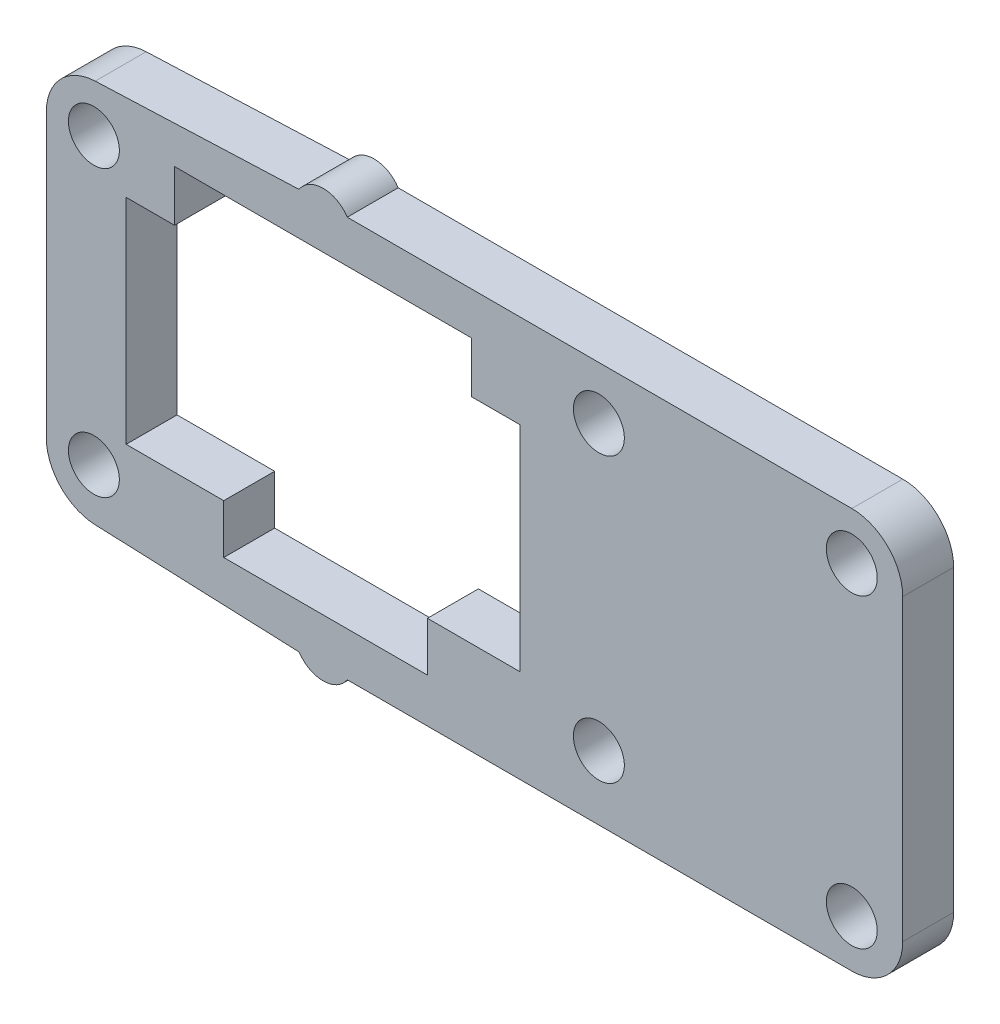
ISO-10303-21;
HEADER;
FILE_DESCRIPTION(('STEP AP214'),'2;1');
FILE_NAME('part.step','',(''),(''),'','','');
FILE_SCHEMA(('AUTOMOTIVE_DESIGN { 1 0 10303 214 1 1 1 1 }'));
ENDSEC;
DATA;
#1=APPLICATION_CONTEXT('core data for automotive mechanical design processes');
#2=APPLICATION_PROTOCOL_DEFINITION('international standard','automotive_design',2000,#1);
#3=PRODUCT_CONTEXT('',#1,'mechanical');
#4=PRODUCT('Part','Part','',(#3));
#5=PRODUCT_RELATED_PRODUCT_CATEGORY('part','',(#4));
#6=PRODUCT_DEFINITION_FORMATION('','',#4);
#7=PRODUCT_DEFINITION_CONTEXT('part definition',#1,'design');
#8=PRODUCT_DEFINITION('design','',#6,#7);
#9=PRODUCT_DEFINITION_SHAPE('','',#8);
#10=(LENGTH_UNIT() NAMED_UNIT(*) SI_UNIT(.MILLI.,.METRE.));
#11=(NAMED_UNIT(*) PLANE_ANGLE_UNIT() SI_UNIT($,.RADIAN.));
#12=(NAMED_UNIT(*) SI_UNIT($,.STERADIAN.) SOLID_ANGLE_UNIT());
#13=UNCERTAINTY_MEASURE_WITH_UNIT(LENGTH_MEASURE(1.E-05),#10,'distance_accuracy_value','');
#14=(GEOMETRIC_REPRESENTATION_CONTEXT(3) GLOBAL_UNCERTAINTY_ASSIGNED_CONTEXT((#13)) GLOBAL_UNIT_ASSIGNED_CONTEXT((#10,
#11,#12)) REPRESENTATION_CONTEXT('',''));
#15=CARTESIAN_POINT('',(0.,0.,0.));
#16=DIRECTION('',(0.,0.,1.));
#17=DIRECTION('',(1.,0.,0.));
#18=AXIS2_PLACEMENT_3D('',#15,#16,#17);
#19=CARTESIAN_POINT('',(734.593549902307,733.876262300404,-3.));
#20=DIRECTION('',(0.,0.,1.));
#21=DIRECTION('',(1.,0.,0.));
#22=AXIS2_PLACEMENT_3D('',#19,#20,#21);
#23=CYLINDRICAL_SURFACE('',#22,2.99999999999839);
#24=CARTESIAN_POINT('',(734.593549902307,733.876262300404,0.));
#25=DIRECTION('',(0.,0.,1.));
#26=DIRECTION('',(-1.,0.,0.));
#27=AXIS2_PLACEMENT_3D('',#24,#25,#26);
#28=CIRCLE('',#27,2.99999999999839);
#29=CARTESIAN_POINT('',(737.593549902304,733.876262300405,0.));
#30=VERTEX_POINT('',#29);
#31=CARTESIAN_POINT('',(734.593549902304,736.876262300405,0.));
#32=VERTEX_POINT('',#31);
#33=EDGE_CURVE('E285',#30,#32,#28,.T.);
#34=ORIENTED_EDGE('',*,*,#33,.F.);
#35=DIRECTION('',(0.,0.,1.));
#36=VECTOR('',#35,1.);
#37=CARTESIAN_POINT('',(737.593549902304,733.876262300405,-3.));
#38=LINE('',#37,#36);
#39=CARTESIAN_POINT('',(737.593549902304,733.876262300405,-3.));
#40=VERTEX_POINT('',#39);
#41=EDGE_CURVE('E11',#40,#30,#38,.T.);
#42=ORIENTED_EDGE('',*,*,#41,.F.);
#43=CARTESIAN_POINT('',(734.593549902307,733.876262300404,-3.));
#44=DIRECTION('',(0.,0.,1.));
#45=DIRECTION('',(-1.,0.,0.));
#46=AXIS2_PLACEMENT_3D('',#43,#44,#45);
#47=CIRCLE('',#46,2.99999999999839);
#48=CARTESIAN_POINT('',(734.593549902304,736.876262300405,-3.));
#49=VERTEX_POINT('',#48);
#50=EDGE_CURVE('E305',#40,#49,#47,.T.);
#51=ORIENTED_EDGE('',*,*,#50,.T.);
#52=DIRECTION('',(0.,0.,1.));
#53=VECTOR('',#52,1.);
#54=CARTESIAN_POINT('',(734.593549902304,736.876262300405,-3.));
#55=LINE('',#54,#53);
#56=EDGE_CURVE('E342',#49,#32,#55,.T.);
#57=ORIENTED_EDGE('',*,*,#56,.T.);
#58=EDGE_LOOP('',(#34,#42,#51,#57));
#59=FACE_BOUND('',#58,.T.);
#60=ADVANCED_FACE('F39',(#59),#23,.T.);
#61=CARTESIAN_POINT('',(737.593549902304,733.876262300405,-3.));
#62=DIRECTION('',(1.,1.76626390281275E-13,0.));
#63=DIRECTION('',(-1.76626390281275E-13,1.,0.));
#64=AXIS2_PLACEMENT_3D('',#61,#62,#63);
#65=PLANE('',#64);
#66=DIRECTION('',(-1.76626390281275E-13,1.,0.));
#67=VECTOR('',#66,1.);
#68=CARTESIAN_POINT('',(737.593549902304,733.876262300405,0.));
#69=LINE('',#68,#67);
#70=CARTESIAN_POINT('',(737.593549902307,716.276262300404,0.));
#71=VERTEX_POINT('',#70);
#72=EDGE_CURVE('E309',#71,#30,#69,.T.);
#73=ORIENTED_EDGE('',*,*,#72,.F.);
#74=DIRECTION('',(0.,0.,1.));
#75=VECTOR('',#74,1.);
#76=CARTESIAN_POINT('',(737.593549902307,716.276262300404,-3.));
#77=LINE('',#76,#75);
#78=CARTESIAN_POINT('',(737.593549902307,716.276262300404,-3.));
#79=VERTEX_POINT('',#78);
#80=EDGE_CURVE('E47',#79,#71,#77,.T.);
#81=ORIENTED_EDGE('',*,*,#80,.F.);
#82=DIRECTION('',(-1.76626390281275E-13,1.,0.));
#83=VECTOR('',#82,1.);
#84=CARTESIAN_POINT('',(737.593549902304,733.876262300405,-3.));
#85=LINE('',#84,#83);
#86=EDGE_CURVE('E339',#79,#40,#85,.T.);
#87=ORIENTED_EDGE('',*,*,#86,.T.);
#88=ORIENTED_EDGE('',*,*,#41,.T.);
#89=EDGE_LOOP('',(#73,#81,#87,#88));
#90=FACE_BOUND('',#89,.T.);
#91=ADVANCED_FACE('F482',(#90),#65,.T.);
#92=CARTESIAN_POINT('',(734.593549902307,716.276262300404,-3.));
#93=DIRECTION('',(0.,0.,1.));
#94=DIRECTION('',(1.,0.,0.));
#95=AXIS2_PLACEMENT_3D('',#92,#93,#94);
#96=CYLINDRICAL_SURFACE('',#95,3.);
#97=CARTESIAN_POINT('',(734.593549902307,716.276262300404,0.));
#98=DIRECTION('',(0.,0.,1.));
#99=DIRECTION('',(-1.,0.,0.));
#100=AXIS2_PLACEMENT_3D('',#97,#98,#99);
#101=CIRCLE('',#100,3.);
#102=CARTESIAN_POINT('',(734.593549902307,713.276262300404,0.));
#103=VERTEX_POINT('',#102);
#104=EDGE_CURVE('E372',#103,#71,#101,.T.);
#105=ORIENTED_EDGE('',*,*,#104,.F.);
#106=DIRECTION('',(0.,0.,1.));
#107=VECTOR('',#106,1.);
#108=CARTESIAN_POINT('',(734.593549902307,713.276262300404,-3.));
#109=LINE('',#108,#107);
#110=CARTESIAN_POINT('',(734.593549902307,713.276262300404,-3.));
#111=VERTEX_POINT('',#110);
#112=EDGE_CURVE('E378',#111,#103,#109,.T.);
#113=ORIENTED_EDGE('',*,*,#112,.F.);
#114=CARTESIAN_POINT('',(734.593549902307,716.276262300404,-3.));
#115=DIRECTION('',(0.,0.,1.));
#116=DIRECTION('',(-1.,0.,0.));
#117=AXIS2_PLACEMENT_3D('',#114,#115,#116);
#118=CIRCLE('',#117,3.);
#119=EDGE_CURVE('E336',#111,#79,#118,.T.);
#120=ORIENTED_EDGE('',*,*,#119,.T.);
#121=ORIENTED_EDGE('',*,*,#80,.T.);
#122=EDGE_LOOP('',(#105,#113,#120,#121));
#123=FACE_BOUND('',#122,.T.);
#124=ADVANCED_FACE('F479',(#123),#96,.T.);
#125=CARTESIAN_POINT('',(734.593549902307,713.276262300404,-3.));
#126=DIRECTION('',(0.,-1.,0.));
#127=DIRECTION('',(1.,0.,0.));
#128=AXIS2_PLACEMENT_3D('',#125,#126,#127);
#129=PLANE('',#128);
#130=DIRECTION('',(1.,0.,0.));
#131=VECTOR('',#130,1.);
#132=CARTESIAN_POINT('',(734.593549902307,713.276262300404,0.));
#133=LINE('',#132,#131);
#134=CARTESIAN_POINT('',(704.870597734541,713.276262300403,0.));
#135=VERTEX_POINT('',#134);
#136=EDGE_CURVE('E369',#135,#103,#133,.T.);
#137=ORIENTED_EDGE('',*,*,#136,.F.);
#138=DIRECTION('',(0.,0.,1.));
#139=VECTOR('',#138,1.);
#140=CARTESIAN_POINT('',(704.870597734541,713.276262300403,-3.));
#141=LINE('',#140,#139);
#142=CARTESIAN_POINT('',(704.870597734541,713.276262300403,-3.));
#143=VERTEX_POINT('',#142);
#144=EDGE_CURVE('E380',#143,#135,#141,.T.);
#145=ORIENTED_EDGE('',*,*,#144,.F.);
#146=DIRECTION('',(1.,0.,0.));
#147=VECTOR('',#146,1.);
#148=CARTESIAN_POINT('',(734.593549902307,713.276262300404,-3.));
#149=LINE('',#148,#147);
#150=EDGE_CURVE('E333',#143,#111,#149,.T.);
#151=ORIENTED_EDGE('',*,*,#150,.T.);
#152=ORIENTED_EDGE('',*,*,#112,.T.);
#153=EDGE_LOOP('',(#137,#145,#151,#152));
#154=FACE_BOUND('',#153,.T.);
#155=ADVANCED_FACE('F475',(#154),#129,.T.);
#156=CARTESIAN_POINT('',(703.450597734539,714.209060325171,-3.));
#157=DIRECTION('',(0.,0.,1.));
#158=DIRECTION('',(1.,0.,0.));
#159=AXIS2_PLACEMENT_3D('',#156,#157,#158);
#160=CYLINDRICAL_SURFACE('',#159,1.69897385354071);
#161=CARTESIAN_POINT('',(703.450597734539,714.209060325171,0.));
#162=DIRECTION('',(0.,0.,1.));
#163=DIRECTION('',(1.,0.,0.));
#164=AXIS2_PLACEMENT_3D('',#161,#162,#163);
#165=CIRCLE('',#164,1.69897385354071);
#166=CARTESIAN_POINT('',(702.030597734537,713.276262300403,0.));
#167=VERTEX_POINT('',#166);
#168=EDGE_CURVE('E366',#167,#135,#165,.T.);
#169=ORIENTED_EDGE('',*,*,#168,.F.);
#170=DIRECTION('',(0.,0.,1.));
#171=VECTOR('',#170,1.);
#172=CARTESIAN_POINT('',(702.030597734537,713.276262300403,-3.));
#173=LINE('',#172,#171);
#174=CARTESIAN_POINT('',(702.030597734537,713.276262300403,-3.));
#175=VERTEX_POINT('',#174);
#176=EDGE_CURVE('E382',#175,#167,#173,.T.);
#177=ORIENTED_EDGE('',*,*,#176,.F.);
#178=CARTESIAN_POINT('',(703.450597734539,714.209060325171,-3.));
#179=DIRECTION('',(0.,0.,1.));
#180=DIRECTION('',(1.,0.,0.));
#181=AXIS2_PLACEMENT_3D('',#178,#179,#180);
#182=CIRCLE('',#181,1.69897385354071);
#183=EDGE_CURVE('E330',#175,#143,#182,.T.);
#184=ORIENTED_EDGE('',*,*,#183,.T.);
#185=ORIENTED_EDGE('',*,*,#144,.T.);
#186=EDGE_LOOP('',(#169,#177,#184,#185));
#187=FACE_BOUND('',#186,.T.);
#188=ADVANCED_FACE('F471',(#187),#160,.T.);
#189=CARTESIAN_POINT('',(690.023398786402,713.757541232946,-3.));
#190=DIRECTION('',(-0.0400503719671436,-0.999197661979497,0.));
#191=DIRECTION('',(0.999197661979497,-0.0400503719671436,0.));
#192=AXIS2_PLACEMENT_3D('',#189,#190,#191);
#193=PLANE('',#192);
#194=DIRECTION('',(0.999197661979497,-0.0400503719671436,0.));
#195=VECTOR('',#194,1.);
#196=CARTESIAN_POINT('',(690.023398786402,713.757541232946,0.));
#197=LINE('',#196,#195);
#198=CARTESIAN_POINT('',(690.023398786402,713.757541232946,0.));
#199=VERTEX_POINT('',#198);
#200=EDGE_CURVE('E363',#199,#167,#197,.T.);
#201=ORIENTED_EDGE('',*,*,#200,.F.);
#202=DIRECTION('',(0.,0.,1.));
#203=VECTOR('',#202,1.);
#204=CARTESIAN_POINT('',(690.023398786402,713.757541232946,-3.));
#205=LINE('',#204,#203);
#206=CARTESIAN_POINT('',(690.023398786402,713.757541232946,-3.));
#207=VERTEX_POINT('',#206);
#208=EDGE_CURVE('E384',#207,#199,#205,.T.);
#209=ORIENTED_EDGE('',*,*,#208,.F.);
#210=DIRECTION('',(0.999197661979497,-0.0400503719671436,0.));
#211=VECTOR('',#210,1.);
#212=CARTESIAN_POINT('',(690.023398786402,713.757541232946,-3.));
#213=LINE('',#212,#211);
#214=EDGE_CURVE('E327',#207,#175,#213,.T.);
#215=ORIENTED_EDGE('',*,*,#214,.T.);
#216=ORIENTED_EDGE('',*,*,#176,.T.);
#217=EDGE_LOOP('',(#201,#209,#215,#216));
#218=FACE_BOUND('',#217,.T.);
#219=ADVANCED_FACE('F467',(#218),#193,.T.);
#220=CARTESIAN_POINT('',(690.143549902304,716.755134218884,-3.));
#221=DIRECTION('',(0.,0.,1.));
#222=DIRECTION('',(1.,0.,0.));
#223=AXIS2_PLACEMENT_3D('',#220,#221,#222);
#224=CYLINDRICAL_SURFACE('',#223,3.);
#225=CARTESIAN_POINT('',(690.143549902304,716.755134218884,0.));
#226=DIRECTION('',(0.,0.,1.));
#227=DIRECTION('',(-1.,0.,0.));
#228=AXIS2_PLACEMENT_3D('',#225,#226,#227);
#229=CIRCLE('',#228,3.);
#230=CARTESIAN_POINT('',(687.143549902304,716.755134218884,0.));
#231=VERTEX_POINT('',#230);
#232=EDGE_CURVE('E360',#231,#199,#229,.T.);
#233=ORIENTED_EDGE('',*,*,#232,.F.);
#234=DIRECTION('',(0.,0.,1.));
#235=VECTOR('',#234,1.);
#236=CARTESIAN_POINT('',(687.143549902304,716.755134218884,-3.));
#237=LINE('',#236,#235);
#238=CARTESIAN_POINT('',(687.143549902304,716.755134218884,-3.));
#239=VERTEX_POINT('',#238);
#240=EDGE_CURVE('E386',#239,#231,#237,.T.);
#241=ORIENTED_EDGE('',*,*,#240,.F.);
#242=CARTESIAN_POINT('',(690.143549902304,716.755134218884,-3.));
#243=DIRECTION('',(0.,0.,1.));
#244=DIRECTION('',(-1.,0.,0.));
#245=AXIS2_PLACEMENT_3D('',#242,#243,#244);
#246=CIRCLE('',#245,3.);
#247=EDGE_CURVE('E324',#239,#207,#246,.T.);
#248=ORIENTED_EDGE('',*,*,#247,.T.);
#249=ORIENTED_EDGE('',*,*,#208,.T.);
#250=EDGE_LOOP('',(#233,#241,#248,#249));
#251=FACE_BOUND('',#250,.T.);
#252=ADVANCED_FACE('F463',(#251),#224,.T.);
#253=CARTESIAN_POINT('',(687.143549902304,716.755134218884,-3.));
#254=DIRECTION('',(-1.,0.,0.));
#255=DIRECTION('',(0.,0.,1.));
#256=AXIS2_PLACEMENT_3D('',#253,#254,#255);
#257=PLANE('',#256);
#258=DIRECTION('',(0.,-1.,0.));
#259=VECTOR('',#258,1.);
#260=CARTESIAN_POINT('',(687.143549902304,716.755134218884,0.));
#261=LINE('',#260,#259);
#262=CARTESIAN_POINT('',(687.143549902303,733.397390381931,0.));
#263=VERTEX_POINT('',#262);
#264=EDGE_CURVE('E357',#263,#231,#261,.T.);
#265=ORIENTED_EDGE('',*,*,#264,.F.);
#266=DIRECTION('',(0.,0.,1.));
#267=VECTOR('',#266,1.);
#268=CARTESIAN_POINT('',(687.143549902303,733.397390381931,-3.));
#269=LINE('',#268,#267);
#270=CARTESIAN_POINT('',(687.143549902303,733.397390381931,-3.));
#271=VERTEX_POINT('',#270);
#272=EDGE_CURVE('E388',#271,#263,#269,.T.);
#273=ORIENTED_EDGE('',*,*,#272,.F.);
#274=DIRECTION('',(0.,-1.,0.));
#275=VECTOR('',#274,1.);
#276=CARTESIAN_POINT('',(687.143549902304,716.755134218884,-3.));
#277=LINE('',#276,#275);
#278=EDGE_CURVE('E321',#271,#239,#277,.T.);
#279=ORIENTED_EDGE('',*,*,#278,.T.);
#280=ORIENTED_EDGE('',*,*,#240,.T.);
#281=EDGE_LOOP('',(#265,#273,#279,#280));
#282=FACE_BOUND('',#281,.T.);
#283=ADVANCED_FACE('F459',(#282),#257,.T.);
#284=CARTESIAN_POINT('',(690.143549902304,733.397390381931,-3.));
#285=DIRECTION('',(0.,0.,1.));
#286=DIRECTION('',(1.,0.,0.));
#287=AXIS2_PLACEMENT_3D('',#284,#285,#286);
#288=CYLINDRICAL_SURFACE('',#287,3.0000000000006);
#289=CARTESIAN_POINT('',(690.143549902304,733.397390381931,0.));
#290=DIRECTION('',(0.,0.,1.));
#291=DIRECTION('',(-1.,0.,0.));
#292=AXIS2_PLACEMENT_3D('',#289,#290,#291);
#293=CIRCLE('',#292,3.0000000000006);
#294=CARTESIAN_POINT('',(690.023398786403,736.394983367871,0.));
#295=VERTEX_POINT('',#294);
#296=EDGE_CURVE('E354',#295,#263,#293,.T.);
#297=ORIENTED_EDGE('',*,*,#296,.F.);
#298=DIRECTION('',(0.,0.,1.));
#299=VECTOR('',#298,1.);
#300=CARTESIAN_POINT('',(690.023398786403,736.394983367871,-3.));
#301=LINE('',#300,#299);
#302=CARTESIAN_POINT('',(690.023398786403,736.394983367871,-3.));
#303=VERTEX_POINT('',#302);
#304=EDGE_CURVE('E390',#303,#295,#301,.T.);
#305=ORIENTED_EDGE('',*,*,#304,.F.);
#306=CARTESIAN_POINT('',(690.143549902304,733.397390381931,-3.));
#307=DIRECTION('',(0.,0.,1.));
#308=DIRECTION('',(-1.,0.,0.));
#309=AXIS2_PLACEMENT_3D('',#306,#307,#308);
#310=CIRCLE('',#309,3.0000000000006);
#311=EDGE_CURVE('E318',#303,#271,#310,.T.);
#312=ORIENTED_EDGE('',*,*,#311,.T.);
#313=ORIENTED_EDGE('',*,*,#272,.T.);
#314=EDGE_LOOP('',(#297,#305,#312,#313));
#315=FACE_BOUND('',#314,.T.);
#316=ADVANCED_FACE('F455',(#315),#288,.T.);
#317=CARTESIAN_POINT('',(690.023398786403,736.394983367871,-3.));
#318=DIRECTION('',(-0.0400503719664016,0.999197661979527,0.));
#319=DIRECTION('',(-0.999197661979527,-0.0400503719664016,0.));
#320=AXIS2_PLACEMENT_3D('',#317,#318,#319);
#321=PLANE('',#320);
#322=DIRECTION('',(-0.999197661979527,-0.0400503719664016,0.));
#323=VECTOR('',#322,1.);
#324=CARTESIAN_POINT('',(690.023398786403,736.394983367871,0.));
#325=LINE('',#324,#323);
#326=CARTESIAN_POINT('',(702.030597734535,736.876262300403,0.));
#327=VERTEX_POINT('',#326);
#328=EDGE_CURVE('E351',#327,#295,#325,.T.);
#329=ORIENTED_EDGE('',*,*,#328,.F.);
#330=DIRECTION('',(0.,0.,1.));
#331=VECTOR('',#330,1.);
#332=CARTESIAN_POINT('',(702.030597734535,736.876262300403,-3.));
#333=LINE('',#332,#331);
#334=CARTESIAN_POINT('',(702.030597734535,736.876262300403,-3.));
#335=VERTEX_POINT('',#334);
#336=EDGE_CURVE('E392',#335,#327,#333,.T.);
#337=ORIENTED_EDGE('',*,*,#336,.F.);
#338=DIRECTION('',(-0.999197661979527,-0.0400503719664016,0.));
#339=VECTOR('',#338,1.);
#340=CARTESIAN_POINT('',(690.023398786403,736.394983367871,-3.));
#341=LINE('',#340,#339);
#342=EDGE_CURVE('E315',#335,#303,#341,.T.);
#343=ORIENTED_EDGE('',*,*,#342,.T.);
#344=ORIENTED_EDGE('',*,*,#304,.T.);
#345=EDGE_LOOP('',(#329,#337,#343,#344));
#346=FACE_BOUND('',#345,.T.);
#347=ADVANCED_FACE('F451',(#346),#321,.T.);
#348=CARTESIAN_POINT('',(703.450597734539,735.943464275637,-3.));
#349=DIRECTION('',(0.,0.,1.));
#350=DIRECTION('',(1.,0.,0.));
#351=AXIS2_PLACEMENT_3D('',#348,#349,#350);
#352=CYLINDRICAL_SURFACE('',#351,1.69897385354212);
#353=CARTESIAN_POINT('',(703.450597734539,735.943464275637,0.));
#354=DIRECTION('',(0.,0.,1.));
#355=DIRECTION('',(-1.,0.,0.));
#356=AXIS2_PLACEMENT_3D('',#353,#354,#355);
#357=CIRCLE('',#356,1.69897385354212);
#358=CARTESIAN_POINT('',(704.870597734537,736.87626230041,0.));
#359=VERTEX_POINT('',#358);
#360=EDGE_CURVE('E348',#359,#327,#357,.T.);
#361=ORIENTED_EDGE('',*,*,#360,.F.);
#362=DIRECTION('',(0.,0.,1.));
#363=VECTOR('',#362,1.);
#364=CARTESIAN_POINT('',(704.870597734537,736.87626230041,-3.));
#365=LINE('',#364,#363);
#366=CARTESIAN_POINT('',(704.870597734537,736.87626230041,-3.));
#367=VERTEX_POINT('',#366);
#368=EDGE_CURVE('E394',#367,#359,#365,.T.);
#369=ORIENTED_EDGE('',*,*,#368,.F.);
#370=CARTESIAN_POINT('',(703.450597734539,735.943464275637,-3.));
#371=DIRECTION('',(0.,0.,1.));
#372=DIRECTION('',(-1.,0.,0.));
#373=AXIS2_PLACEMENT_3D('',#370,#371,#372);
#374=CIRCLE('',#373,1.69897385354212);
#375=EDGE_CURVE('E312',#367,#335,#374,.T.);
#376=ORIENTED_EDGE('',*,*,#375,.T.);
#377=ORIENTED_EDGE('',*,*,#336,.T.);
#378=EDGE_LOOP('',(#361,#369,#376,#377));
#379=FACE_BOUND('',#378,.T.);
#380=ADVANCED_FACE('F447',(#379),#352,.T.);
#381=CARTESIAN_POINT('',(704.870597734537,736.87626230041,-3.));
#382=DIRECTION('',(1.71820951177723E-13,1.,0.));
#383=DIRECTION('',(-1.,1.71820951177723E-13,0.));
#384=AXIS2_PLACEMENT_3D('',#381,#382,#383);
#385=PLANE('',#384);
#386=DIRECTION('',(-1.,1.71820951177723E-13,0.));
#387=VECTOR('',#386,1.);
#388=CARTESIAN_POINT('',(704.870597734537,736.87626230041,0.));
#389=LINE('',#388,#387);
#390=EDGE_CURVE('E345',#32,#359,#389,.T.);
#391=ORIENTED_EDGE('',*,*,#390,.F.);
#392=ORIENTED_EDGE('',*,*,#56,.F.);
#393=DIRECTION('',(-1.,1.71820951177723E-13,0.));
#394=VECTOR('',#393,1.);
#395=CARTESIAN_POINT('',(704.870597734537,736.87626230041,-3.));
#396=LINE('',#395,#394);
#397=EDGE_CURVE('E308',#49,#367,#396,.T.);
#398=ORIENTED_EDGE('',*,*,#397,.T.);
#399=ORIENTED_EDGE('',*,*,#368,.T.);
#400=EDGE_LOOP('',(#391,#392,#398,#399));
#401=FACE_BOUND('',#400,.T.);
#402=ADVANCED_FACE('F443',(#401),#385,.T.);
#403=CARTESIAN_POINT('',(734.593549902307,733.876262300404,-3.));
#404=DIRECTION('',(0.,0.,-1.));
#405=DIRECTION('',(-1.,0.,0.));
#406=AXIS2_PLACEMENT_3D('',#403,#404,#405);
#407=PLANE('',#406);
#408=CARTESIAN_POINT('',(689.943549902354,733.563854452482,-3.));
#409=DIRECTION('',(0.,0.,-1.));
#410=DIRECTION('',(-1.,0.,0.));
#411=AXIS2_PLACEMENT_3D('',#408,#409,#410);
#412=CIRCLE('',#411,1.50000000001319);
#413=CARTESIAN_POINT('',(688.44354990234,733.563854452482,-3.));
#414=VERTEX_POINT('',#413);
#415=EDGE_CURVE('E732',#414,#414,#412,.T.);
#416=ORIENTED_EDGE('',*,*,#415,.F.);
#417=EDGE_LOOP('',(#416));
#418=FACE_BOUND('',#417,.T.);
#419=CARTESIAN_POINT('',(719.693549902354,717.068635687268,-3.));
#420=DIRECTION('',(0.,0.,-1.));
#421=DIRECTION('',(-1.,0.,0.));
#422=AXIS2_PLACEMENT_3D('',#419,#420,#421);
#423=CIRCLE('',#422,1.50000000001308);
#424=CARTESIAN_POINT('',(718.193549902341,717.068635687268,-3.));
#425=VERTEX_POINT('',#424);
#426=EDGE_CURVE('E733',#425,#425,#423,.T.);
#427=ORIENTED_EDGE('',*,*,#426,.F.);
#428=EDGE_LOOP('',(#427));
#429=FACE_BOUND('',#428,.T.);
#430=CARTESIAN_POINT('',(719.693549902354,733.768635687267,-3.));
#431=DIRECTION('',(0.,0.,-1.));
#432=DIRECTION('',(-1.,0.,0.));
#433=AXIS2_PLACEMENT_3D('',#430,#431,#432);
#434=CIRCLE('',#433,1.50000000001308);
#435=CARTESIAN_POINT('',(718.193549902341,733.768635687267,-3.));
#436=VERTEX_POINT('',#435);
#437=EDGE_CURVE('E400',#436,#436,#434,.T.);
#438=ORIENTED_EDGE('',*,*,#437,.F.);
#439=EDGE_LOOP('',(#438));
#440=FACE_BOUND('',#439,.T.);
#441=CARTESIAN_POINT('',(734.593549902304,734.076262300404,-3.));
#442=DIRECTION('',(0.,0.,1.));
#443=DIRECTION('',(1.,0.,0.));
#444=AXIS2_PLACEMENT_3D('',#441,#442,#443);
#445=CIRCLE('',#444,1.49999999999997);
#446=CARTESIAN_POINT('',(736.093549902304,734.076262300404,-3.));
#447=VERTEX_POINT('',#446);
#448=EDGE_CURVE('E409',#447,#447,#445,.T.);
#449=ORIENTED_EDGE('',*,*,#448,.T.);
#450=EDGE_LOOP('',(#449));
#451=FACE_BOUND('',#450,.T.);
#452=CARTESIAN_POINT('',(734.593549902307,716.076262300404,-3.));
#453=DIRECTION('',(0.,0.,1.));
#454=DIRECTION('',(1.,0.,0.));
#455=AXIS2_PLACEMENT_3D('',#452,#453,#454);
#456=CIRCLE('',#455,1.49999999999997);
#457=CARTESIAN_POINT('',(736.093549902307,716.076262300404,-3.));
#458=VERTEX_POINT('',#457);
#459=EDGE_CURVE('E418',#458,#458,#456,.T.);
#460=ORIENTED_EDGE('',*,*,#459,.T.);
#461=EDGE_LOOP('',(#460));
#462=FACE_BOUND('',#461,.T.);
#463=CARTESIAN_POINT('',(689.943549902304,716.776262300404,-3.));
#464=DIRECTION('',(0.,0.,1.));
#465=DIRECTION('',(1.,0.,0.));
#466=AXIS2_PLACEMENT_3D('',#463,#464,#465);
#467=CIRCLE('',#466,1.49999999999997);
#468=CARTESIAN_POINT('',(691.443549902304,716.776262300404,-3.));
#469=VERTEX_POINT('',#468);
#470=EDGE_CURVE('E255',#469,#469,#467,.T.);
#471=ORIENTED_EDGE('',*,*,#470,.T.);
#472=EDGE_LOOP('',(#471));
#473=FACE_BOUND('',#472,.T.);
#474=DIRECTION('',(0.,-1.,0.));
#475=VECTOR('',#474,1.);
#476=CARTESIAN_POINT('',(694.693549902304,731.376262300411,-3.));
#477=LINE('',#476,#475);
#478=CARTESIAN_POINT('',(694.693549902304,734.376262300408,-3.));
#479=VERTEX_POINT('',#478);
#480=CARTESIAN_POINT('',(694.693549902304,731.376262300411,-3.));
#481=VERTEX_POINT('',#480);
#482=EDGE_CURVE('E202',#479,#481,#477,.T.);
#483=ORIENTED_EDGE('',*,*,#482,.T.);
#484=DIRECTION('',(-1.,0.,0.));
#485=VECTOR('',#484,1.);
#486=CARTESIAN_POINT('',(691.843549902304,731.376262300411,-3.));
#487=LINE('',#486,#485);
#488=CARTESIAN_POINT('',(691.843549902304,731.376262300411,-3.));
#489=VERTEX_POINT('',#488);
#490=EDGE_CURVE('E211',#481,#489,#487,.T.);
#491=ORIENTED_EDGE('',*,*,#490,.T.);
#492=DIRECTION('',(0.,-1.,0.));
#493=VECTOR('',#492,1.);
#494=CARTESIAN_POINT('',(691.843549902304,718.776262300404,-3.));
#495=LINE('',#494,#493);
#496=CARTESIAN_POINT('',(691.843549902304,718.776262300404,-3.));
#497=VERTEX_POINT('',#496);
#498=EDGE_CURVE('E55',#489,#497,#495,.T.);
#499=ORIENTED_EDGE('',*,*,#498,.T.);
#500=DIRECTION('',(1.,0.,0.));
#501=VECTOR('',#500,1.);
#502=CARTESIAN_POINT('',(697.593549902304,718.776262300404,-3.));
#503=LINE('',#502,#501);
#504=CARTESIAN_POINT('',(697.593549902304,718.776262300404,-3.));
#505=VERTEX_POINT('',#504);
#506=EDGE_CURVE('E229',#497,#505,#503,.T.);
#507=ORIENTED_EDGE('',*,*,#506,.T.);
#508=DIRECTION('',(0.,-1.,0.));
#509=VECTOR('',#508,1.);
#510=CARTESIAN_POINT('',(697.593549902304,715.87626230041,-3.));
#511=LINE('',#510,#509);
#512=CARTESIAN_POINT('',(697.593549902304,715.87626230041,-3.));
#513=VERTEX_POINT('',#512);
#514=EDGE_CURVE('E232',#505,#513,#511,.T.);
#515=ORIENTED_EDGE('',*,*,#514,.T.);
#516=DIRECTION('',(1.,-1.5728159515523E-13,0.));
#517=VECTOR('',#516,1.);
#518=CARTESIAN_POINT('',(709.593549902304,715.876262300408,-3.));
#519=LINE('',#518,#517);
#520=CARTESIAN_POINT('',(709.593549902304,715.876262300408,-3.));
#521=VERTEX_POINT('',#520);
#522=EDGE_CURVE('E235',#513,#521,#519,.T.);
#523=ORIENTED_EDGE('',*,*,#522,.T.);
#524=DIRECTION('',(0.,1.,0.));
#525=VECTOR('',#524,1.);
#526=CARTESIAN_POINT('',(709.593549902304,718.776262300404,-3.));
#527=LINE('',#526,#525);
#528=CARTESIAN_POINT('',(709.593549902304,718.776262300404,-3.));
#529=VERTEX_POINT('',#528);
#530=EDGE_CURVE('E238',#521,#529,#527,.T.);
#531=ORIENTED_EDGE('',*,*,#530,.T.);
#532=DIRECTION('',(1.,0.,0.));
#533=VECTOR('',#532,1.);
#534=CARTESIAN_POINT('',(715.043549902304,718.776262300404,-3.));
#535=LINE('',#534,#533);
#536=CARTESIAN_POINT('',(715.043549902304,718.776262300404,-3.));
#537=VERTEX_POINT('',#536);
#538=EDGE_CURVE('E241',#529,#537,#535,.T.);
#539=ORIENTED_EDGE('',*,*,#538,.T.);
#540=DIRECTION('',(0.,1.,0.));
#541=VECTOR('',#540,1.);
#542=CARTESIAN_POINT('',(715.043549902304,731.376262300408,-3.));
#543=LINE('',#542,#541);
#544=CARTESIAN_POINT('',(715.043549902304,731.376262300408,-3.));
#545=VERTEX_POINT('',#544);
#546=EDGE_CURVE('E244',#537,#545,#543,.T.);
#547=ORIENTED_EDGE('',*,*,#546,.T.);
#548=DIRECTION('',(-1.,0.,0.));
#549=VECTOR('',#548,1.);
#550=CARTESIAN_POINT('',(712.193549902304,731.376262300408,-3.));
#551=LINE('',#550,#549);
#552=CARTESIAN_POINT('',(712.193549902304,731.376262300408,-3.));
#553=VERTEX_POINT('',#552);
#554=EDGE_CURVE('E247',#545,#553,#551,.T.);
#555=ORIENTED_EDGE('',*,*,#554,.T.);
#556=DIRECTION('',(0.,1.,0.));
#557=VECTOR('',#556,1.);
#558=CARTESIAN_POINT('',(712.193549902304,734.376262300408,-3.));
#559=LINE('',#558,#557);
#560=CARTESIAN_POINT('',(712.193549902304,734.376262300408,-3.));
#561=VERTEX_POINT('',#560);
#562=EDGE_CURVE('E250',#553,#561,#559,.T.);
#563=ORIENTED_EDGE('',*,*,#562,.T.);
#564=DIRECTION('',(-1.,0.,0.));
#565=VECTOR('',#564,1.);
#566=CARTESIAN_POINT('',(694.693549902304,734.376262300408,-3.));
#567=LINE('',#566,#565);
#568=EDGE_CURVE('E208',#561,#479,#567,.T.);
#569=ORIENTED_EDGE('',*,*,#568,.T.);
#570=EDGE_LOOP('',(#483,#491,#499,#507,#515,#523,#531,#539,#547,#555,#563,#569));
#571=FACE_BOUND('',#570,.T.);
#572=ORIENTED_EDGE('',*,*,#50,.F.);
#573=ORIENTED_EDGE('',*,*,#86,.F.);
#574=ORIENTED_EDGE('',*,*,#119,.F.);
#575=ORIENTED_EDGE('',*,*,#150,.F.);
#576=ORIENTED_EDGE('',*,*,#183,.F.);
#577=ORIENTED_EDGE('',*,*,#214,.F.);
#578=ORIENTED_EDGE('',*,*,#247,.F.);
#579=ORIENTED_EDGE('',*,*,#278,.F.);
#580=ORIENTED_EDGE('',*,*,#311,.F.);
#581=ORIENTED_EDGE('',*,*,#342,.F.);
#582=ORIENTED_EDGE('',*,*,#375,.F.);
#583=ORIENTED_EDGE('',*,*,#397,.F.);
#584=EDGE_LOOP('',(#572,#573,#574,#575,#576,#577,#578,#579,#580,#581,#582,#583));
#585=FACE_BOUND('',#584,.T.);
#586=ADVANCED_FACE('F215',(#418,#429,#440,#451,#462,#473,#571,#585),#407,.T.);
#587=CARTESIAN_POINT('',(734.593549902307,733.876262300404,0.));
#588=DIRECTION('',(0.,0.,-1.));
#589=DIRECTION('',(-1.,0.,0.));
#590=AXIS2_PLACEMENT_3D('',#587,#588,#589);
#591=PLANE('',#590);
#592=CARTESIAN_POINT('',(689.943549902354,733.563854452482,0.));
#593=DIRECTION('',(0.,0.,-1.));
#594=DIRECTION('',(-1.,0.,0.));
#595=AXIS2_PLACEMENT_3D('',#592,#593,#594);
#596=CIRCLE('',#595,1.50000000001319);
#597=CARTESIAN_POINT('',(688.44354990234,733.563854452482,0.));
#598=VERTEX_POINT('',#597);
#599=EDGE_CURVE('E42',#598,#598,#596,.T.);
#600=ORIENTED_EDGE('',*,*,#599,.T.);
#601=EDGE_LOOP('',(#600));
#602=FACE_BOUND('',#601,.T.);
#603=CARTESIAN_POINT('',(719.693549902354,717.068635687268,0.));
#604=DIRECTION('',(0.,0.,-1.));
#605=DIRECTION('',(-1.,0.,0.));
#606=AXIS2_PLACEMENT_3D('',#603,#604,#605);
#607=CIRCLE('',#606,1.50000000001308);
#608=CARTESIAN_POINT('',(718.193549902341,717.068635687268,0.));
#609=VERTEX_POINT('',#608);
#610=EDGE_CURVE('E399',#609,#609,#607,.T.);
#611=ORIENTED_EDGE('',*,*,#610,.T.);
#612=EDGE_LOOP('',(#611));
#613=FACE_BOUND('',#612,.T.);
#614=CARTESIAN_POINT('',(719.693549902354,733.768635687267,0.));
#615=DIRECTION('',(0.,0.,-1.));
#616=DIRECTION('',(-1.,0.,0.));
#617=AXIS2_PLACEMENT_3D('',#614,#615,#616);
#618=CIRCLE('',#617,1.50000000001308);
#619=CARTESIAN_POINT('',(718.193549902341,733.768635687267,0.));
#620=VERTEX_POINT('',#619);
#621=EDGE_CURVE('E397',#620,#620,#618,.T.);
#622=ORIENTED_EDGE('',*,*,#621,.T.);
#623=EDGE_LOOP('',(#622));
#624=FACE_BOUND('',#623,.T.);
#625=CARTESIAN_POINT('',(734.593549902304,734.076262300404,0.));
#626=DIRECTION('',(0.,0.,1.));
#627=DIRECTION('',(1.,0.,0.));
#628=AXIS2_PLACEMENT_3D('',#625,#626,#627);
#629=CIRCLE('',#628,1.49999999999997);
#630=CARTESIAN_POINT('',(736.093549902304,734.076262300404,0.));
#631=VERTEX_POINT('',#630);
#632=EDGE_CURVE('E405',#631,#631,#629,.T.);
#633=ORIENTED_EDGE('',*,*,#632,.F.);
#634=EDGE_LOOP('',(#633));
#635=FACE_BOUND('',#634,.T.);
#636=CARTESIAN_POINT('',(734.593549902307,716.076262300404,0.));
#637=DIRECTION('',(0.,0.,1.));
#638=DIRECTION('',(1.,0.,0.));
#639=AXIS2_PLACEMENT_3D('',#636,#637,#638);
#640=CIRCLE('',#639,1.49999999999997);
#641=CARTESIAN_POINT('',(736.093549902307,716.076262300404,0.));
#642=VERTEX_POINT('',#641);
#643=EDGE_CURVE('E414',#642,#642,#640,.T.);
#644=ORIENTED_EDGE('',*,*,#643,.F.);
#645=EDGE_LOOP('',(#644));
#646=FACE_BOUND('',#645,.T.);
#647=CARTESIAN_POINT('',(689.943549902304,716.776262300404,0.));
#648=DIRECTION('',(0.,0.,1.));
#649=DIRECTION('',(1.,0.,0.));
#650=AXIS2_PLACEMENT_3D('',#647,#648,#649);
#651=CIRCLE('',#650,1.49999999999997);
#652=CARTESIAN_POINT('',(691.443549902304,716.776262300404,0.));
#653=VERTEX_POINT('',#652);
#654=EDGE_CURVE('E225',#653,#653,#651,.T.);
#655=ORIENTED_EDGE('',*,*,#654,.F.);
#656=EDGE_LOOP('',(#655));
#657=FACE_BOUND('',#656,.T.);
#658=DIRECTION('',(-1.,0.,0.));
#659=VECTOR('',#658,1.);
#660=CARTESIAN_POINT('',(691.843549902304,731.376262300411,0.));
#661=LINE('',#660,#659);
#662=CARTESIAN_POINT('',(694.693549902304,731.376262300411,0.));
#663=VERTEX_POINT('',#662);
#664=CARTESIAN_POINT('',(691.843549902304,731.376262300411,0.));
#665=VERTEX_POINT('',#664);
#666=EDGE_CURVE('E254',#663,#665,#661,.T.);
#667=ORIENTED_EDGE('',*,*,#666,.F.);
#668=DIRECTION('',(0.,-1.,0.));
#669=VECTOR('',#668,1.);
#670=CARTESIAN_POINT('',(694.693549902304,731.376262300411,0.));
#671=LINE('',#670,#669);
#672=CARTESIAN_POINT('',(694.693549902304,734.376262300408,0.));
#673=VERTEX_POINT('',#672);
#674=EDGE_CURVE('E63',#673,#663,#671,.T.);
#675=ORIENTED_EDGE('',*,*,#674,.F.);
#676=DIRECTION('',(-1.,0.,0.));
#677=VECTOR('',#676,1.);
#678=CARTESIAN_POINT('',(694.693549902304,734.376262300408,0.));
#679=LINE('',#678,#677);
#680=CARTESIAN_POINT('',(712.193549902304,734.376262300408,0.));
#681=VERTEX_POINT('',#680);
#682=EDGE_CURVE('E219',#681,#673,#679,.T.);
#683=ORIENTED_EDGE('',*,*,#682,.F.);
#684=DIRECTION('',(0.,1.,0.));
#685=VECTOR('',#684,1.);
#686=CARTESIAN_POINT('',(712.193549902304,734.376262300408,0.));
#687=LINE('',#686,#685);
#688=CARTESIAN_POINT('',(712.193549902304,731.376262300408,0.));
#689=VERTEX_POINT('',#688);
#690=EDGE_CURVE('E222',#689,#681,#687,.T.);
#691=ORIENTED_EDGE('',*,*,#690,.F.);
#692=DIRECTION('',(-1.,0.,0.));
#693=VECTOR('',#692,1.);
#694=CARTESIAN_POINT('',(712.193549902304,731.376262300408,0.));
#695=LINE('',#694,#693);
#696=CARTESIAN_POINT('',(715.043549902304,731.376262300408,0.));
#697=VERTEX_POINT('',#696);
#698=EDGE_CURVE('E278',#697,#689,#695,.T.);
#699=ORIENTED_EDGE('',*,*,#698,.F.);
#700=DIRECTION('',(0.,1.,0.));
#701=VECTOR('',#700,1.);
#702=CARTESIAN_POINT('',(715.043549902304,731.376262300408,0.));
#703=LINE('',#702,#701);
#704=CARTESIAN_POINT('',(715.043549902304,718.776262300404,0.));
#705=VERTEX_POINT('',#704);
#706=EDGE_CURVE('E275',#705,#697,#703,.T.);
#707=ORIENTED_EDGE('',*,*,#706,.F.);
#708=DIRECTION('',(1.,0.,0.));
#709=VECTOR('',#708,1.);
#710=CARTESIAN_POINT('',(715.043549902304,718.776262300404,0.));
#711=LINE('',#710,#709);
#712=CARTESIAN_POINT('',(709.593549902304,718.776262300404,0.));
#713=VERTEX_POINT('',#712);
#714=EDGE_CURVE('E272',#713,#705,#711,.T.);
#715=ORIENTED_EDGE('',*,*,#714,.F.);
#716=DIRECTION('',(0.,1.,0.));
#717=VECTOR('',#716,1.);
#718=CARTESIAN_POINT('',(709.593549902304,718.776262300404,0.));
#719=LINE('',#718,#717);
#720=CARTESIAN_POINT('',(709.593549902304,715.876262300408,0.));
#721=VERTEX_POINT('',#720);
#722=EDGE_CURVE('E269',#721,#713,#719,.T.);
#723=ORIENTED_EDGE('',*,*,#722,.F.);
#724=DIRECTION('',(1.,-1.5728159515523E-13,0.));
#725=VECTOR('',#724,1.);
#726=CARTESIAN_POINT('',(709.593549902304,715.876262300408,0.));
#727=LINE('',#726,#725);
#728=CARTESIAN_POINT('',(697.593549902304,715.87626230041,0.));
#729=VERTEX_POINT('',#728);
#730=EDGE_CURVE('E266',#729,#721,#727,.T.);
#731=ORIENTED_EDGE('',*,*,#730,.F.);
#732=DIRECTION('',(0.,-1.,0.));
#733=VECTOR('',#732,1.);
#734=CARTESIAN_POINT('',(697.593549902304,715.87626230041,0.));
#735=LINE('',#734,#733);
#736=CARTESIAN_POINT('',(697.593549902304,718.776262300404,0.));
#737=VERTEX_POINT('',#736);
#738=EDGE_CURVE('E263',#737,#729,#735,.T.);
#739=ORIENTED_EDGE('',*,*,#738,.F.);
#740=DIRECTION('',(1.,0.,0.));
#741=VECTOR('',#740,1.);
#742=CARTESIAN_POINT('',(697.593549902304,718.776262300404,0.));
#743=LINE('',#742,#741);
#744=CARTESIAN_POINT('',(691.843549902304,718.776262300404,0.));
#745=VERTEX_POINT('',#744);
#746=EDGE_CURVE('E260',#745,#737,#743,.T.);
#747=ORIENTED_EDGE('',*,*,#746,.F.);
#748=DIRECTION('',(0.,-1.,0.));
#749=VECTOR('',#748,1.);
#750=CARTESIAN_POINT('',(691.843549902304,718.776262300404,0.));
#751=LINE('',#750,#749);
#752=EDGE_CURVE('E257',#665,#745,#751,.T.);
#753=ORIENTED_EDGE('',*,*,#752,.F.);
#754=EDGE_LOOP('',(#667,#675,#683,#691,#699,#707,#715,#723,#731,#739,#747,#753));
#755=FACE_BOUND('',#754,.T.);
#756=ORIENTED_EDGE('',*,*,#33,.T.);
#757=ORIENTED_EDGE('',*,*,#390,.T.);
#758=ORIENTED_EDGE('',*,*,#360,.T.);
#759=ORIENTED_EDGE('',*,*,#328,.T.);
#760=ORIENTED_EDGE('',*,*,#296,.T.);
#761=ORIENTED_EDGE('',*,*,#264,.T.);
#762=ORIENTED_EDGE('',*,*,#232,.T.);
#763=ORIENTED_EDGE('',*,*,#200,.T.);
#764=ORIENTED_EDGE('',*,*,#168,.T.);
#765=ORIENTED_EDGE('',*,*,#136,.T.);
#766=ORIENTED_EDGE('',*,*,#104,.T.);
#767=ORIENTED_EDGE('',*,*,#72,.T.);
#768=EDGE_LOOP('',(#756,#757,#758,#759,#760,#761,#762,#763,#764,#765,#766,#767));
#769=FACE_BOUND('',#768,.T.);
#770=ADVANCED_FACE('F430',(#602,#613,#624,#635,#646,#657,#755,#769),#591,.F.);
#771=CARTESIAN_POINT('',(694.693549902304,731.376262300411,-3.));
#772=DIRECTION('',(-1.,0.,0.));
#773=DIRECTION('',(0.,0.,1.));
#774=AXIS2_PLACEMENT_3D('',#771,#772,#773);
#775=PLANE('',#774);
#776=ORIENTED_EDGE('',*,*,#674,.T.);
#777=DIRECTION('',(0.,0.,1.));
#778=VECTOR('',#777,1.);
#779=CARTESIAN_POINT('',(694.693549902304,731.376262300411,-3.));
#780=LINE('',#779,#778);
#781=EDGE_CURVE('E198',#481,#663,#780,.T.);
#782=ORIENTED_EDGE('',*,*,#781,.F.);
#783=ORIENTED_EDGE('',*,*,#482,.F.);
#784=DIRECTION('',(0.,0.,1.));
#785=VECTOR('',#784,1.);
#786=CARTESIAN_POINT('',(694.693549902304,734.376262300408,-3.));
#787=LINE('',#786,#785);
#788=EDGE_CURVE('E283',#479,#673,#787,.T.);
#789=ORIENTED_EDGE('',*,*,#788,.T.);
#790=EDGE_LOOP('',(#776,#782,#783,#789));
#791=FACE_BOUND('',#790,.T.);
#792=ADVANCED_FACE('F200',(#791),#775,.F.);
#793=CARTESIAN_POINT('',(694.693549902304,734.376262300408,-3.));
#794=DIRECTION('',(0.,1.,0.));
#795=DIRECTION('',(-1.,0.,0.));
#796=AXIS2_PLACEMENT_3D('',#793,#794,#795);
#797=PLANE('',#796);
#798=ORIENTED_EDGE('',*,*,#682,.T.);
#799=ORIENTED_EDGE('',*,*,#788,.F.);
#800=ORIENTED_EDGE('',*,*,#568,.F.);
#801=DIRECTION('',(0.,0.,1.));
#802=VECTOR('',#801,1.);
#803=CARTESIAN_POINT('',(712.193549902304,734.376262300408,-3.));
#804=LINE('',#803,#802);
#805=EDGE_CURVE('E286',#561,#681,#804,.T.);
#806=ORIENTED_EDGE('',*,*,#805,.T.);
#807=EDGE_LOOP('',(#798,#799,#800,#806));
#808=FACE_BOUND('',#807,.T.);
#809=ADVANCED_FACE('F536',(#808),#797,.F.);
#810=CARTESIAN_POINT('',(712.193549902304,734.376262300408,-3.));
#811=DIRECTION('',(1.,0.,0.));
#812=DIRECTION('',(0.,0.,-1.));
#813=AXIS2_PLACEMENT_3D('',#810,#811,#812);
#814=PLANE('',#813);
#815=ORIENTED_EDGE('',*,*,#690,.T.);
#816=ORIENTED_EDGE('',*,*,#805,.F.);
#817=ORIENTED_EDGE('',*,*,#562,.F.);
#818=DIRECTION('',(0.,0.,1.));
#819=VECTOR('',#818,1.);
#820=CARTESIAN_POINT('',(712.193549902304,731.376262300408,-3.));
#821=LINE('',#820,#819);
#822=EDGE_CURVE('E288',#553,#689,#821,.T.);
#823=ORIENTED_EDGE('',*,*,#822,.T.);
#824=EDGE_LOOP('',(#815,#816,#817,#823));
#825=FACE_BOUND('',#824,.T.);
#826=ADVANCED_FACE('F546',(#825),#814,.F.);
#827=CARTESIAN_POINT('',(712.193549902304,731.376262300408,-3.));
#828=DIRECTION('',(0.,1.,0.));
#829=DIRECTION('',(-1.,0.,0.));
#830=AXIS2_PLACEMENT_3D('',#827,#828,#829);
#831=PLANE('',#830);
#832=ORIENTED_EDGE('',*,*,#698,.T.);
#833=ORIENTED_EDGE('',*,*,#822,.F.);
#834=ORIENTED_EDGE('',*,*,#554,.F.);
#835=DIRECTION('',(0.,0.,1.));
#836=VECTOR('',#835,1.);
#837=CARTESIAN_POINT('',(715.043549902304,731.376262300408,-3.));
#838=LINE('',#837,#836);
#839=EDGE_CURVE('E290',#545,#697,#838,.T.);
#840=ORIENTED_EDGE('',*,*,#839,.T.);
#841=EDGE_LOOP('',(#832,#833,#834,#840));
#842=FACE_BOUND('',#841,.T.);
#843=ADVANCED_FACE('F557',(#842),#831,.F.);
#844=CARTESIAN_POINT('',(715.043549902304,731.376262300408,-3.));
#845=DIRECTION('',(1.,0.,0.));
#846=DIRECTION('',(0.,0.,-1.));
#847=AXIS2_PLACEMENT_3D('',#844,#845,#846);
#848=PLANE('',#847);
#849=ORIENTED_EDGE('',*,*,#706,.T.);
#850=ORIENTED_EDGE('',*,*,#839,.F.);
#851=ORIENTED_EDGE('',*,*,#546,.F.);
#852=DIRECTION('',(0.,0.,1.));
#853=VECTOR('',#852,1.);
#854=CARTESIAN_POINT('',(715.043549902304,718.776262300404,-3.));
#855=LINE('',#854,#853);
#856=EDGE_CURVE('E292',#537,#705,#855,.T.);
#857=ORIENTED_EDGE('',*,*,#856,.T.);
#858=EDGE_LOOP('',(#849,#850,#851,#857));
#859=FACE_BOUND('',#858,.T.);
#860=ADVANCED_FACE('F568',(#859),#848,.F.);
#861=CARTESIAN_POINT('',(715.043549902304,718.776262300404,-3.));
#862=DIRECTION('',(0.,-1.,0.));
#863=DIRECTION('',(0.,0.,-1.));
#864=AXIS2_PLACEMENT_3D('',#861,#862,#863);
#865=PLANE('',#864);
#866=ORIENTED_EDGE('',*,*,#714,.T.);
#867=ORIENTED_EDGE('',*,*,#856,.F.);
#868=ORIENTED_EDGE('',*,*,#538,.F.);
#869=DIRECTION('',(0.,0.,1.));
#870=VECTOR('',#869,1.);
#871=CARTESIAN_POINT('',(709.593549902304,718.776262300404,-3.));
#872=LINE('',#871,#870);
#873=EDGE_CURVE('E294',#529,#713,#872,.T.);
#874=ORIENTED_EDGE('',*,*,#873,.T.);
#875=EDGE_LOOP('',(#866,#867,#868,#874));
#876=FACE_BOUND('',#875,.T.);
#877=ADVANCED_FACE('F579',(#876),#865,.F.);
#878=CARTESIAN_POINT('',(709.593549902304,718.776262300404,-3.));
#879=DIRECTION('',(1.,0.,0.));
#880=DIRECTION('',(0.,0.,-1.));
#881=AXIS2_PLACEMENT_3D('',#878,#879,#880);
#882=PLANE('',#881);
#883=ORIENTED_EDGE('',*,*,#722,.T.);
#884=ORIENTED_EDGE('',*,*,#873,.F.);
#885=ORIENTED_EDGE('',*,*,#530,.F.);
#886=DIRECTION('',(0.,0.,1.));
#887=VECTOR('',#886,1.);
#888=CARTESIAN_POINT('',(709.593549902304,715.876262300408,-3.));
#889=LINE('',#888,#887);
#890=EDGE_CURVE('E296',#521,#721,#889,.T.);
#891=ORIENTED_EDGE('',*,*,#890,.T.);
#892=EDGE_LOOP('',(#883,#884,#885,#891));
#893=FACE_BOUND('',#892,.T.);
#894=ADVANCED_FACE('F590',(#893),#882,.F.);
#895=CARTESIAN_POINT('',(709.593549902304,715.876262300408,-3.));
#896=DIRECTION('',(-1.5728159515523E-13,-1.,0.));
#897=DIRECTION('',(1.,-1.5728159515523E-13,0.));
#898=AXIS2_PLACEMENT_3D('',#895,#896,#897);
#899=PLANE('',#898);
#900=ORIENTED_EDGE('',*,*,#730,.T.);
#901=ORIENTED_EDGE('',*,*,#890,.F.);
#902=ORIENTED_EDGE('',*,*,#522,.F.);
#903=DIRECTION('',(0.,0.,1.));
#904=VECTOR('',#903,1.);
#905=CARTESIAN_POINT('',(697.593549902304,715.87626230041,-3.));
#906=LINE('',#905,#904);
#907=EDGE_CURVE('E298',#513,#729,#906,.T.);
#908=ORIENTED_EDGE('',*,*,#907,.T.);
#909=EDGE_LOOP('',(#900,#901,#902,#908));
#910=FACE_BOUND('',#909,.T.);
#911=ADVANCED_FACE('F601',(#910),#899,.F.);
#912=CARTESIAN_POINT('',(697.593549902304,715.87626230041,-3.));
#913=DIRECTION('',(-1.,0.,0.));
#914=DIRECTION('',(0.,0.,1.));
#915=AXIS2_PLACEMENT_3D('',#912,#913,#914);
#916=PLANE('',#915);
#917=ORIENTED_EDGE('',*,*,#738,.T.);
#918=ORIENTED_EDGE('',*,*,#907,.F.);
#919=ORIENTED_EDGE('',*,*,#514,.F.);
#920=DIRECTION('',(0.,0.,1.));
#921=VECTOR('',#920,1.);
#922=CARTESIAN_POINT('',(697.593549902304,718.776262300404,-3.));
#923=LINE('',#922,#921);
#924=EDGE_CURVE('E300',#505,#737,#923,.T.);
#925=ORIENTED_EDGE('',*,*,#924,.T.);
#926=EDGE_LOOP('',(#917,#918,#919,#925));
#927=FACE_BOUND('',#926,.T.);
#928=ADVANCED_FACE('F612',(#927),#916,.F.);
#929=CARTESIAN_POINT('',(697.593549902304,718.776262300404,-3.));
#930=DIRECTION('',(0.,-1.,0.));
#931=DIRECTION('',(0.,0.,-1.));
#932=AXIS2_PLACEMENT_3D('',#929,#930,#931);
#933=PLANE('',#932);
#934=ORIENTED_EDGE('',*,*,#746,.T.);
#935=ORIENTED_EDGE('',*,*,#924,.F.);
#936=ORIENTED_EDGE('',*,*,#506,.F.);
#937=DIRECTION('',(0.,0.,1.));
#938=VECTOR('',#937,1.);
#939=CARTESIAN_POINT('',(691.843549902304,718.776262300404,-3.));
#940=LINE('',#939,#938);
#941=EDGE_CURVE('E302',#497,#745,#940,.T.);
#942=ORIENTED_EDGE('',*,*,#941,.T.);
#943=EDGE_LOOP('',(#934,#935,#936,#942));
#944=FACE_BOUND('',#943,.T.);
#945=ADVANCED_FACE('F623',(#944),#933,.F.);
#946=CARTESIAN_POINT('',(691.843549902304,718.776262300404,-3.));
#947=DIRECTION('',(-1.,0.,0.));
#948=DIRECTION('',(0.,0.,1.));
#949=AXIS2_PLACEMENT_3D('',#946,#947,#948);
#950=PLANE('',#949);
#951=ORIENTED_EDGE('',*,*,#752,.T.);
#952=ORIENTED_EDGE('',*,*,#941,.F.);
#953=ORIENTED_EDGE('',*,*,#498,.F.);
#954=DIRECTION('',(0.,0.,1.));
#955=VECTOR('',#954,1.);
#956=CARTESIAN_POINT('',(691.843549902304,731.376262300411,-3.));
#957=LINE('',#956,#955);
#958=EDGE_CURVE('E207',#489,#665,#957,.T.);
#959=ORIENTED_EDGE('',*,*,#958,.T.);
#960=EDGE_LOOP('',(#951,#952,#953,#959));
#961=FACE_BOUND('',#960,.T.);
#962=ADVANCED_FACE('F634',(#961),#950,.F.);
#963=CARTESIAN_POINT('',(691.843549902304,731.376262300411,-3.));
#964=DIRECTION('',(0.,1.,0.));
#965=DIRECTION('',(-1.,0.,0.));
#966=AXIS2_PLACEMENT_3D('',#963,#964,#965);
#967=PLANE('',#966);
#968=ORIENTED_EDGE('',*,*,#666,.T.);
#969=ORIENTED_EDGE('',*,*,#958,.F.);
#970=ORIENTED_EDGE('',*,*,#490,.F.);
#971=ORIENTED_EDGE('',*,*,#781,.T.);
#972=EDGE_LOOP('',(#968,#969,#970,#971));
#973=FACE_BOUND('',#972,.T.);
#974=ADVANCED_FACE('F212',(#973),#967,.F.);
#975=CARTESIAN_POINT('',(689.943549902304,716.776262300404,-3.));
#976=DIRECTION('',(0.,0.,1.));
#977=DIRECTION('',(1.,0.,0.));
#978=AXIS2_PLACEMENT_3D('',#975,#976,#977);
#979=CYLINDRICAL_SURFACE('',#978,1.49999999999997);
#980=ORIENTED_EDGE('',*,*,#470,.F.);
#981=EDGE_LOOP('',(#980));
#982=FACE_BOUND('',#981,.T.);
#983=ORIENTED_EDGE('',*,*,#654,.T.);
#984=EDGE_LOOP('',(#983));
#985=FACE_BOUND('',#984,.T.);
#986=ADVANCED_FACE('F428',(#982,#985),#979,.F.);
#987=CARTESIAN_POINT('',(734.593549902307,716.076262300404,-3.));
#988=DIRECTION('',(0.,0.,1.));
#989=DIRECTION('',(1.,0.,0.));
#990=AXIS2_PLACEMENT_3D('',#987,#988,#989);
#991=CYLINDRICAL_SURFACE('',#990,1.49999999999997);
#992=ORIENTED_EDGE('',*,*,#459,.F.);
#993=EDGE_LOOP('',(#992));
#994=FACE_BOUND('',#993,.T.);
#995=ORIENTED_EDGE('',*,*,#643,.T.);
#996=EDGE_LOOP('',(#995));
#997=FACE_BOUND('',#996,.T.);
#998=ADVANCED_FACE('F663',(#994,#997),#991,.F.);
#999=CARTESIAN_POINT('',(734.593549902304,734.076262300404,-3.));
#1000=DIRECTION('',(0.,0.,1.));
#1001=DIRECTION('',(1.,0.,0.));
#1002=AXIS2_PLACEMENT_3D('',#999,#1000,#1001);
#1003=CYLINDRICAL_SURFACE('',#1002,1.49999999999997);
#1004=ORIENTED_EDGE('',*,*,#448,.F.);
#1005=EDGE_LOOP('',(#1004));
#1006=FACE_BOUND('',#1005,.T.);
#1007=ORIENTED_EDGE('',*,*,#632,.T.);
#1008=EDGE_LOOP('',(#1007));
#1009=FACE_BOUND('',#1008,.T.);
#1010=ADVANCED_FACE('F674',(#1006,#1009),#1003,.F.);
#1011=CARTESIAN_POINT('',(719.693549902354,733.768635687267,7.));
#1012=DIRECTION('',(0.,0.,-1.));
#1013=DIRECTION('',(-1.,0.,0.));
#1014=AXIS2_PLACEMENT_3D('',#1011,#1012,#1013);
#1015=CYLINDRICAL_SURFACE('',#1014,1.50000000001308);
#1016=ORIENTED_EDGE('',*,*,#437,.T.);
#1017=EDGE_LOOP('',(#1016));
#1018=FACE_BOUND('',#1017,.T.);
#1019=ORIENTED_EDGE('',*,*,#621,.F.);
#1020=EDGE_LOOP('',(#1019));
#1021=FACE_BOUND('',#1020,.T.);
#1022=ADVANCED_FACE('F684',(#1018,#1021),#1015,.F.);
#1023=CARTESIAN_POINT('',(719.693549902354,717.068635687268,7.));
#1024=DIRECTION('',(0.,0.,-1.));
#1025=DIRECTION('',(-1.,0.,0.));
#1026=AXIS2_PLACEMENT_3D('',#1023,#1024,#1025);
#1027=CYLINDRICAL_SURFACE('',#1026,1.50000000001308);
#1028=ORIENTED_EDGE('',*,*,#426,.T.);
#1029=EDGE_LOOP('',(#1028));
#1030=FACE_BOUND('',#1029,.T.);
#1031=ORIENTED_EDGE('',*,*,#610,.F.);
#1032=EDGE_LOOP('',(#1031));
#1033=FACE_BOUND('',#1032,.T.);
#1034=ADVANCED_FACE('F706',(#1030,#1033),#1027,.F.);
#1035=CARTESIAN_POINT('',(689.943549902354,733.563854452482,7.));
#1036=DIRECTION('',(0.,0.,-1.));
#1037=DIRECTION('',(-1.,0.,0.));
#1038=AXIS2_PLACEMENT_3D('',#1035,#1036,#1037);
#1039=CYLINDRICAL_SURFACE('',#1038,1.50000000001319);
#1040=ORIENTED_EDGE('',*,*,#415,.T.);
#1041=EDGE_LOOP('',(#1040));
#1042=FACE_BOUND('',#1041,.T.);
#1043=ORIENTED_EDGE('',*,*,#599,.F.);
#1044=EDGE_LOOP('',(#1043));
#1045=FACE_BOUND('',#1044,.T.);
#1046=ADVANCED_FACE('F716',(#1042,#1045),#1039,.F.);
#1047=CLOSED_SHELL('',(#60,#91,#124,#155,#188,#219,#252,#283,#316,#347,#380,#402,#586,#770,#792,
#809,#826,#843,#860,#877,#894,#911,#928,#945,#962,#974,#986,#998,#1010,#1022,#1034,#1046));
#1048=MANIFOLD_SOLID_BREP('B2',#1047);
#1049=ADVANCED_BREP_SHAPE_REPRESENTATION('',(#18,#1048),#14);
#1050=SHAPE_DEFINITION_REPRESENTATION(#9,#1049);
ENDSEC;
END-ISO-10303-21;
